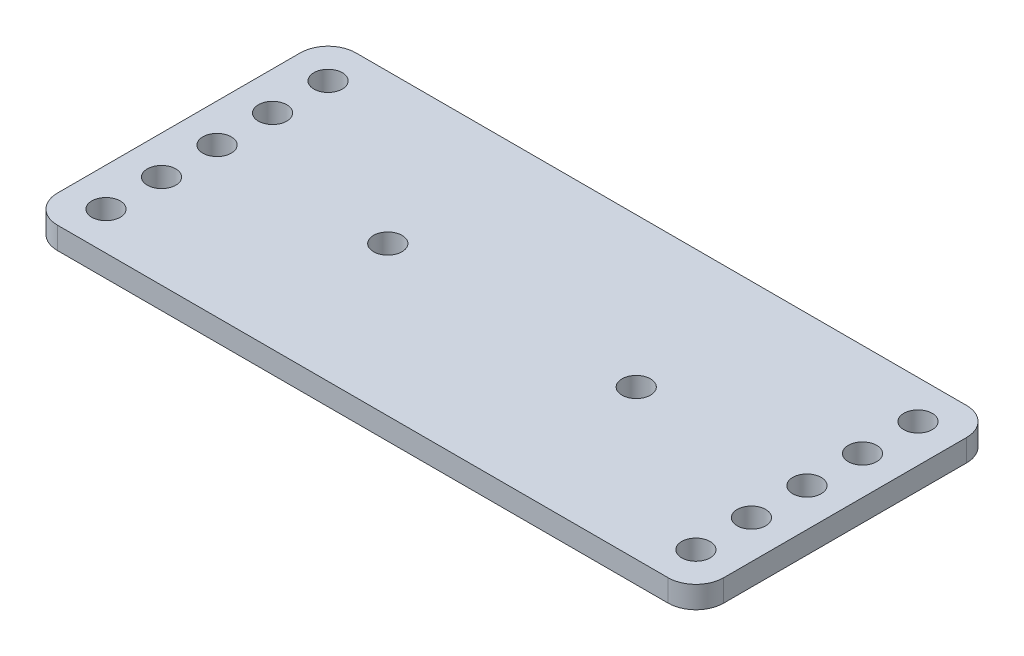
ISO-10303-21;
HEADER;
FILE_DESCRIPTION(('STEP AP214'),'2;1');
FILE_NAME('part.step','',(''),(''),'','','');
FILE_SCHEMA(('AUTOMOTIVE_DESIGN { 1 0 10303 214 1 1 1 1 }'));
ENDSEC;
DATA;
#1=APPLICATION_CONTEXT('core data for automotive mechanical design processes');
#2=APPLICATION_PROTOCOL_DEFINITION('international standard','automotive_design',2000,#1);
#3=PRODUCT_CONTEXT('',#1,'mechanical');
#4=PRODUCT('Part','Part','',(#3));
#5=PRODUCT_RELATED_PRODUCT_CATEGORY('part','',(#4));
#6=PRODUCT_DEFINITION_FORMATION('','',#4);
#7=PRODUCT_DEFINITION_CONTEXT('part definition',#1,'design');
#8=PRODUCT_DEFINITION('design','',#6,#7);
#9=PRODUCT_DEFINITION_SHAPE('','',#8);
#10=(LENGTH_UNIT() NAMED_UNIT(*) SI_UNIT(.MILLI.,.METRE.));
#11=(NAMED_UNIT(*) PLANE_ANGLE_UNIT() SI_UNIT($,.RADIAN.));
#12=(NAMED_UNIT(*) SI_UNIT($,.STERADIAN.) SOLID_ANGLE_UNIT());
#13=UNCERTAINTY_MEASURE_WITH_UNIT(LENGTH_MEASURE(1.E-05),#10,'distance_accuracy_value','');
#14=(GEOMETRIC_REPRESENTATION_CONTEXT(3) GLOBAL_UNCERTAINTY_ASSIGNED_CONTEXT((#13)) GLOBAL_UNIT_ASSIGNED_CONTEXT((#10,
#11,#12)) REPRESENTATION_CONTEXT('',''));
#15=CARTESIAN_POINT('',(0.,0.,0.));
#16=DIRECTION('',(0.,0.,1.));
#17=DIRECTION('',(1.,0.,0.));
#18=AXIS2_PLACEMENT_3D('',#15,#16,#17);
#19=CARTESIAN_POINT('',(0.,3.175,0.));
#20=DIRECTION('',(0.,1.,0.));
#21=DIRECTION('',(0.,0.,1.));
#22=AXIS2_PLACEMENT_3D('',#19,#20,#21);
#23=PLANE('',#22);
#24=CARTESIAN_POINT('',(42.4999999999997,3.175,16.));
#25=DIRECTION('',(0.,1.,0.));
#26=DIRECTION('',(0.,0.,-1.));
#27=AXIS2_PLACEMENT_3D('',#24,#25,#26);
#28=CIRCLE('',#27,2.05);
#29=CARTESIAN_POINT('',(42.4999999999997,3.175,13.95));
#30=VERTEX_POINT('',#29);
#31=EDGE_CURVE('E237',#30,#30,#28,.T.);
#32=ORIENTED_EDGE('',*,*,#31,.F.);
#33=EDGE_LOOP('',(#32));
#34=FACE_BOUND('',#33,.T.);
#35=CARTESIAN_POINT('',(42.4999999999998,3.175,0.));
#36=DIRECTION('',(0.,1.,0.));
#37=DIRECTION('',(0.,0.,-1.));
#38=AXIS2_PLACEMENT_3D('',#35,#36,#37);
#39=CIRCLE('',#38,2.05);
#40=CARTESIAN_POINT('',(42.4999999999998,3.175,-2.05));
#41=VERTEX_POINT('',#40);
#42=EDGE_CURVE('E225',#41,#41,#39,.T.);
#43=ORIENTED_EDGE('',*,*,#42,.F.);
#44=EDGE_LOOP('',(#43));
#45=FACE_BOUND('',#44,.T.);
#46=CARTESIAN_POINT('',(42.5,3.175,-16.));
#47=DIRECTION('',(0.,1.,0.));
#48=DIRECTION('',(0.,0.,-1.));
#49=AXIS2_PLACEMENT_3D('',#46,#47,#48);
#50=CIRCLE('',#49,2.05);
#51=CARTESIAN_POINT('',(42.5,3.175,-18.05));
#52=VERTEX_POINT('',#51);
#53=EDGE_CURVE('E213',#52,#52,#50,.T.);
#54=ORIENTED_EDGE('',*,*,#53,.F.);
#55=EDGE_LOOP('',(#54));
#56=FACE_BOUND('',#55,.T.);
#57=CARTESIAN_POINT('',(-42.4999999999997,3.175,8.));
#58=DIRECTION('',(0.,1.,0.));
#59=DIRECTION('',(0.,0.,1.));
#60=AXIS2_PLACEMENT_3D('',#57,#58,#59);
#61=CIRCLE('',#60,2.05);
#62=CARTESIAN_POINT('',(-42.4999999999997,3.175,10.05));
#63=VERTEX_POINT('',#62);
#64=EDGE_CURVE('E201',#63,#63,#61,.T.);
#65=ORIENTED_EDGE('',*,*,#64,.F.);
#66=EDGE_LOOP('',(#65));
#67=FACE_BOUND('',#66,.T.);
#68=CARTESIAN_POINT('',(-42.4999999999999,3.175,-8.));
#69=DIRECTION('',(0.,1.,0.));
#70=DIRECTION('',(0.,0.,1.));
#71=AXIS2_PLACEMENT_3D('',#68,#69,#70);
#72=CIRCLE('',#71,2.05);
#73=CARTESIAN_POINT('',(-42.4999999999999,3.175,-5.95));
#74=VERTEX_POINT('',#73);
#75=EDGE_CURVE('E189',#74,#74,#72,.T.);
#76=ORIENTED_EDGE('',*,*,#75,.F.);
#77=EDGE_LOOP('',(#76));
#78=FACE_BOUND('',#77,.T.);
#79=CARTESIAN_POINT('',(-17.9,3.175,0.));
#80=DIRECTION('',(0.,1.,0.));
#81=DIRECTION('',(0.,0.,1.));
#82=AXIS2_PLACEMENT_3D('',#79,#80,#81);
#83=CIRCLE('',#82,2.05);
#84=CARTESIAN_POINT('',(-17.9,3.175,2.05));
#85=VERTEX_POINT('',#84);
#86=EDGE_CURVE('E175',#85,#85,#83,.T.);
#87=ORIENTED_EDGE('',*,*,#86,.F.);
#88=EDGE_LOOP('',(#87));
#89=FACE_BOUND('',#88,.T.);
#90=DIRECTION('',(1.,0.,0.));
#91=VECTOR('',#90,1.);
#92=CARTESIAN_POINT('',(48.,3.175,21.5));
#93=LINE('',#92,#91);
#94=CARTESIAN_POINT('',(-44.,3.175,21.5));
#95=VERTEX_POINT('',#94);
#96=CARTESIAN_POINT('',(44.,3.175,21.5));
#97=VERTEX_POINT('',#96);
#98=EDGE_CURVE('E170',#95,#97,#93,.T.);
#99=ORIENTED_EDGE('',*,*,#98,.T.);
#100=CARTESIAN_POINT('',(44.,3.175,17.5));
#101=DIRECTION('',(0.,1.,0.));
#102=DIRECTION('',(0.,0.,1.));
#103=AXIS2_PLACEMENT_3D('',#100,#101,#102);
#104=CIRCLE('',#103,4.);
#105=CARTESIAN_POINT('',(48.,3.175,17.5));
#106=VERTEX_POINT('',#105);
#107=EDGE_CURVE('E151',#97,#106,#104,.T.);
#108=ORIENTED_EDGE('',*,*,#107,.T.);
#109=DIRECTION('',(0.,0.,-1.));
#110=VECTOR('',#109,1.);
#111=CARTESIAN_POINT('',(48.,3.175,21.5));
#112=LINE('',#111,#110);
#113=CARTESIAN_POINT('',(48.,3.175,-17.5));
#114=VERTEX_POINT('',#113);
#115=EDGE_CURVE('E121',#106,#114,#112,.T.);
#116=ORIENTED_EDGE('',*,*,#115,.T.);
#117=CARTESIAN_POINT('',(44.,3.175,-17.5));
#118=DIRECTION('',(0.,1.,0.));
#119=DIRECTION('',(0.,0.,1.));
#120=AXIS2_PLACEMENT_3D('',#117,#118,#119);
#121=CIRCLE('',#120,4.);
#122=CARTESIAN_POINT('',(44.,3.175,-21.5));
#123=VERTEX_POINT('',#122);
#124=EDGE_CURVE('E57',#114,#123,#121,.T.);
#125=ORIENTED_EDGE('',*,*,#124,.T.);
#126=DIRECTION('',(-1.,0.,0.));
#127=VECTOR('',#126,1.);
#128=CARTESIAN_POINT('',(48.,3.175,-21.5));
#129=LINE('',#128,#127);
#130=CARTESIAN_POINT('',(-44.,3.175,-21.5));
#131=VERTEX_POINT('',#130);
#132=EDGE_CURVE('E137',#123,#131,#129,.T.);
#133=ORIENTED_EDGE('',*,*,#132,.T.);
#134=CARTESIAN_POINT('',(-44.,3.175,-17.5));
#135=DIRECTION('',(0.,1.,0.));
#136=DIRECTION('',(0.,0.,1.));
#137=AXIS2_PLACEMENT_3D('',#134,#135,#136);
#138=CIRCLE('',#137,4.);
#139=CARTESIAN_POINT('',(-48.,3.175,-17.5));
#140=VERTEX_POINT('',#139);
#141=EDGE_CURVE('E148',#131,#140,#138,.T.);
#142=ORIENTED_EDGE('',*,*,#141,.T.);
#143=DIRECTION('',(0.,0.,1.));
#144=VECTOR('',#143,1.);
#145=CARTESIAN_POINT('',(-48.,3.175,21.5));
#146=LINE('',#145,#144);
#147=CARTESIAN_POINT('',(-48.,3.175,17.5));
#148=VERTEX_POINT('',#147);
#149=EDGE_CURVE('E131',#140,#148,#146,.T.);
#150=ORIENTED_EDGE('',*,*,#149,.T.);
#151=CARTESIAN_POINT('',(-44.,3.175,17.5));
#152=DIRECTION('',(0.,1.,0.));
#153=DIRECTION('',(0.,0.,1.));
#154=AXIS2_PLACEMENT_3D('',#151,#152,#153);
#155=CIRCLE('',#154,4.);
#156=EDGE_CURVE('E146',#148,#95,#155,.T.);
#157=ORIENTED_EDGE('',*,*,#156,.T.);
#158=EDGE_LOOP('',(#99,#108,#116,#125,#133,#142,#150,#157));
#159=FACE_BOUND('',#158,.T.);
#160=CARTESIAN_POINT('',(-42.5,3.175,-16.));
#161=DIRECTION('',(0.,1.,0.));
#162=DIRECTION('',(0.,0.,1.));
#163=AXIS2_PLACEMENT_3D('',#160,#161,#162);
#164=CIRCLE('',#163,2.05);
#165=CARTESIAN_POINT('',(-42.5,3.175,-13.95));
#166=VERTEX_POINT('',#165);
#167=EDGE_CURVE('E184',#166,#166,#164,.T.);
#168=ORIENTED_EDGE('',*,*,#167,.F.);
#169=EDGE_LOOP('',(#168));
#170=FACE_BOUND('',#169,.T.);
#171=CARTESIAN_POINT('',(-42.4999999999998,3.175,0.));
#172=DIRECTION('',(0.,1.,0.));
#173=DIRECTION('',(0.,0.,1.));
#174=AXIS2_PLACEMENT_3D('',#171,#172,#173);
#175=CIRCLE('',#174,2.05);
#176=CARTESIAN_POINT('',(-42.4999999999998,3.175,2.05));
#177=VERTEX_POINT('',#176);
#178=EDGE_CURVE('E195',#177,#177,#175,.T.);
#179=ORIENTED_EDGE('',*,*,#178,.F.);
#180=EDGE_LOOP('',(#179));
#181=FACE_BOUND('',#180,.T.);
#182=CARTESIAN_POINT('',(-42.4999999999997,3.175,16.));
#183=DIRECTION('',(0.,1.,0.));
#184=DIRECTION('',(0.,0.,1.));
#185=AXIS2_PLACEMENT_3D('',#182,#183,#184);
#186=CIRCLE('',#185,2.05);
#187=CARTESIAN_POINT('',(-42.4999999999997,3.175,18.05));
#188=VERTEX_POINT('',#187);
#189=EDGE_CURVE('E207',#188,#188,#186,.T.);
#190=ORIENTED_EDGE('',*,*,#189,.F.);
#191=EDGE_LOOP('',(#190));
#192=FACE_BOUND('',#191,.T.);
#193=CARTESIAN_POINT('',(42.4999999999999,3.175,-8.));
#194=DIRECTION('',(0.,1.,0.));
#195=DIRECTION('',(0.,0.,-1.));
#196=AXIS2_PLACEMENT_3D('',#193,#194,#195);
#197=CIRCLE('',#196,2.05);
#198=CARTESIAN_POINT('',(42.4999999999999,3.175,-10.05));
#199=VERTEX_POINT('',#198);
#200=EDGE_CURVE('E219',#199,#199,#197,.T.);
#201=ORIENTED_EDGE('',*,*,#200,.F.);
#202=EDGE_LOOP('',(#201));
#203=FACE_BOUND('',#202,.T.);
#204=CARTESIAN_POINT('',(42.4999999999997,3.175,8.));
#205=DIRECTION('',(0.,1.,0.));
#206=DIRECTION('',(0.,0.,-1.));
#207=AXIS2_PLACEMENT_3D('',#204,#205,#206);
#208=CIRCLE('',#207,2.05);
#209=CARTESIAN_POINT('',(42.4999999999997,3.175,5.95));
#210=VERTEX_POINT('',#209);
#211=EDGE_CURVE('E231',#210,#210,#208,.T.);
#212=ORIENTED_EDGE('',*,*,#211,.F.);
#213=EDGE_LOOP('',(#212));
#214=FACE_BOUND('',#213,.T.);
#215=CARTESIAN_POINT('',(17.9,3.175,0.));
#216=DIRECTION('',(0.,1.,0.));
#217=DIRECTION('',(0.,0.,1.));
#218=AXIS2_PLACEMENT_3D('',#215,#216,#217);
#219=CIRCLE('',#218,2.05);
#220=CARTESIAN_POINT('',(17.9,3.175,2.05));
#221=VERTEX_POINT('',#220);
#222=EDGE_CURVE('E243',#221,#221,#219,.T.);
#223=ORIENTED_EDGE('',*,*,#222,.F.);
#224=EDGE_LOOP('',(#223));
#225=FACE_BOUND('',#224,.T.);
#226=ADVANCED_FACE('F35',(#34,#45,#56,#67,#78,#89,#159,#170,#181,#192,#203,#214,#225),#23,.T.);
#227=CARTESIAN_POINT('',(0.,0.,0.));
#228=DIRECTION('',(0.,1.,0.));
#229=DIRECTION('',(0.,0.,1.));
#230=AXIS2_PLACEMENT_3D('',#227,#228,#229);
#231=PLANE('',#230);
#232=DIRECTION('',(0.,0.,-1.));
#233=VECTOR('',#232,1.);
#234=CARTESIAN_POINT('',(48.,0.,21.5));
#235=LINE('',#234,#233);
#236=CARTESIAN_POINT('',(48.,0.,17.5));
#237=VERTEX_POINT('',#236);
#238=CARTESIAN_POINT('',(48.,0.,-17.5));
#239=VERTEX_POINT('',#238);
#240=EDGE_CURVE('E119',#237,#239,#235,.T.);
#241=ORIENTED_EDGE('',*,*,#240,.F.);
#242=CARTESIAN_POINT('',(44.,0.,17.5));
#243=DIRECTION('',(0.,1.,0.));
#244=DIRECTION('',(0.,0.,1.));
#245=AXIS2_PLACEMENT_3D('',#242,#243,#244);
#246=CIRCLE('',#245,4.);
#247=CARTESIAN_POINT('',(44.,0.,21.5));
#248=VERTEX_POINT('',#247);
#249=EDGE_CURVE('E102',#237,#248,#246,.F.);
#250=ORIENTED_EDGE('',*,*,#249,.T.);
#251=DIRECTION('',(1.,0.,0.));
#252=VECTOR('',#251,1.);
#253=CARTESIAN_POINT('',(48.,0.,21.5));
#254=LINE('',#253,#252);
#255=CARTESIAN_POINT('',(-44.,0.,21.5));
#256=VERTEX_POINT('',#255);
#257=EDGE_CURVE('E129',#256,#248,#254,.T.);
#258=ORIENTED_EDGE('',*,*,#257,.F.);
#259=CARTESIAN_POINT('',(-44.,0.,17.5));
#260=DIRECTION('',(0.,1.,0.));
#261=DIRECTION('',(0.,0.,1.));
#262=AXIS2_PLACEMENT_3D('',#259,#260,#261);
#263=CIRCLE('',#262,4.);
#264=CARTESIAN_POINT('',(-48.,0.,17.5));
#265=VERTEX_POINT('',#264);
#266=EDGE_CURVE('E122',#256,#265,#263,.F.);
#267=ORIENTED_EDGE('',*,*,#266,.T.);
#268=DIRECTION('',(0.,0.,1.));
#269=VECTOR('',#268,1.);
#270=CARTESIAN_POINT('',(-48.,0.,21.5));
#271=LINE('',#270,#269);
#272=CARTESIAN_POINT('',(-48.,0.,-17.5));
#273=VERTEX_POINT('',#272);
#274=EDGE_CURVE('E133',#273,#265,#271,.T.);
#275=ORIENTED_EDGE('',*,*,#274,.F.);
#276=CARTESIAN_POINT('',(-44.,0.,-17.5));
#277=DIRECTION('',(0.,1.,0.));
#278=DIRECTION('',(0.,0.,1.));
#279=AXIS2_PLACEMENT_3D('',#276,#277,#278);
#280=CIRCLE('',#279,4.);
#281=CARTESIAN_POINT('',(-44.,0.,-21.5));
#282=VERTEX_POINT('',#281);
#283=EDGE_CURVE('E140',#273,#282,#280,.F.);
#284=ORIENTED_EDGE('',*,*,#283,.T.);
#285=DIRECTION('',(-1.,0.,0.));
#286=VECTOR('',#285,1.);
#287=CARTESIAN_POINT('',(48.,0.,-21.5));
#288=LINE('',#287,#286);
#289=CARTESIAN_POINT('',(44.,0.,-21.5));
#290=VERTEX_POINT('',#289);
#291=EDGE_CURVE('E128',#290,#282,#288,.T.);
#292=ORIENTED_EDGE('',*,*,#291,.F.);
#293=CARTESIAN_POINT('',(44.,0.,-17.5));
#294=DIRECTION('',(0.,1.,0.));
#295=DIRECTION('',(0.,0.,1.));
#296=AXIS2_PLACEMENT_3D('',#293,#294,#295);
#297=CIRCLE('',#296,4.);
#298=EDGE_CURVE('E113',#290,#239,#297,.F.);
#299=ORIENTED_EDGE('',*,*,#298,.T.);
#300=EDGE_LOOP('',(#241,#250,#258,#267,#275,#284,#292,#299));
#301=FACE_BOUND('',#300,.T.);
#302=CARTESIAN_POINT('',(-17.9,0.,0.));
#303=DIRECTION('',(0.,1.,0.));
#304=DIRECTION('',(0.,0.,1.));
#305=AXIS2_PLACEMENT_3D('',#302,#303,#304);
#306=CIRCLE('',#305,2.05);
#307=CARTESIAN_POINT('',(-17.9,0.,2.05));
#308=VERTEX_POINT('',#307);
#309=EDGE_CURVE('E177',#308,#308,#306,.T.);
#310=ORIENTED_EDGE('',*,*,#309,.T.);
#311=EDGE_LOOP('',(#310));
#312=FACE_BOUND('',#311,.T.);
#313=CARTESIAN_POINT('',(-42.5,0.,-16.));
#314=DIRECTION('',(0.,1.,0.));
#315=DIRECTION('',(0.,0.,1.));
#316=AXIS2_PLACEMENT_3D('',#313,#314,#315);
#317=CIRCLE('',#316,2.05);
#318=CARTESIAN_POINT('',(-42.5,0.,-13.95));
#319=VERTEX_POINT('',#318);
#320=EDGE_CURVE('E186',#319,#319,#317,.T.);
#321=ORIENTED_EDGE('',*,*,#320,.T.);
#322=EDGE_LOOP('',(#321));
#323=FACE_BOUND('',#322,.T.);
#324=CARTESIAN_POINT('',(-42.4999999999999,0.,-8.));
#325=DIRECTION('',(0.,1.,0.));
#326=DIRECTION('',(0.,0.,1.));
#327=AXIS2_PLACEMENT_3D('',#324,#325,#326);
#328=CIRCLE('',#327,2.05);
#329=CARTESIAN_POINT('',(-42.4999999999999,0.,-5.95));
#330=VERTEX_POINT('',#329);
#331=EDGE_CURVE('E192',#330,#330,#328,.T.);
#332=ORIENTED_EDGE('',*,*,#331,.T.);
#333=EDGE_LOOP('',(#332));
#334=FACE_BOUND('',#333,.T.);
#335=CARTESIAN_POINT('',(-42.4999999999998,0.,0.));
#336=DIRECTION('',(0.,1.,0.));
#337=DIRECTION('',(0.,0.,1.));
#338=AXIS2_PLACEMENT_3D('',#335,#336,#337);
#339=CIRCLE('',#338,2.05);
#340=CARTESIAN_POINT('',(-42.4999999999998,0.,2.05));
#341=VERTEX_POINT('',#340);
#342=EDGE_CURVE('E198',#341,#341,#339,.T.);
#343=ORIENTED_EDGE('',*,*,#342,.T.);
#344=EDGE_LOOP('',(#343));
#345=FACE_BOUND('',#344,.T.);
#346=CARTESIAN_POINT('',(-42.4999999999997,0.,8.));
#347=DIRECTION('',(0.,1.,0.));
#348=DIRECTION('',(0.,0.,1.));
#349=AXIS2_PLACEMENT_3D('',#346,#347,#348);
#350=CIRCLE('',#349,2.05);
#351=CARTESIAN_POINT('',(-42.4999999999997,0.,10.05));
#352=VERTEX_POINT('',#351);
#353=EDGE_CURVE('E204',#352,#352,#350,.T.);
#354=ORIENTED_EDGE('',*,*,#353,.T.);
#355=EDGE_LOOP('',(#354));
#356=FACE_BOUND('',#355,.T.);
#357=CARTESIAN_POINT('',(-42.4999999999997,0.,16.));
#358=DIRECTION('',(0.,1.,0.));
#359=DIRECTION('',(0.,0.,1.));
#360=AXIS2_PLACEMENT_3D('',#357,#358,#359);
#361=CIRCLE('',#360,2.05);
#362=CARTESIAN_POINT('',(-42.4999999999997,0.,18.05));
#363=VERTEX_POINT('',#362);
#364=EDGE_CURVE('E210',#363,#363,#361,.T.);
#365=ORIENTED_EDGE('',*,*,#364,.T.);
#366=EDGE_LOOP('',(#365));
#367=FACE_BOUND('',#366,.T.);
#368=CARTESIAN_POINT('',(42.5,0.,-16.));
#369=DIRECTION('',(0.,1.,0.));
#370=DIRECTION('',(0.,0.,-1.));
#371=AXIS2_PLACEMENT_3D('',#368,#369,#370);
#372=CIRCLE('',#371,2.05);
#373=CARTESIAN_POINT('',(42.5,0.,-18.05));
#374=VERTEX_POINT('',#373);
#375=EDGE_CURVE('E216',#374,#374,#372,.T.);
#376=ORIENTED_EDGE('',*,*,#375,.T.);
#377=EDGE_LOOP('',(#376));
#378=FACE_BOUND('',#377,.T.);
#379=CARTESIAN_POINT('',(42.4999999999999,0.,-8.));
#380=DIRECTION('',(0.,1.,0.));
#381=DIRECTION('',(0.,0.,-1.));
#382=AXIS2_PLACEMENT_3D('',#379,#380,#381);
#383=CIRCLE('',#382,2.05);
#384=CARTESIAN_POINT('',(42.4999999999999,0.,-10.05));
#385=VERTEX_POINT('',#384);
#386=EDGE_CURVE('E222',#385,#385,#383,.T.);
#387=ORIENTED_EDGE('',*,*,#386,.T.);
#388=EDGE_LOOP('',(#387));
#389=FACE_BOUND('',#388,.T.);
#390=CARTESIAN_POINT('',(42.4999999999998,0.,0.));
#391=DIRECTION('',(0.,1.,0.));
#392=DIRECTION('',(0.,0.,-1.));
#393=AXIS2_PLACEMENT_3D('',#390,#391,#392);
#394=CIRCLE('',#393,2.05);
#395=CARTESIAN_POINT('',(42.4999999999998,0.,-2.05));
#396=VERTEX_POINT('',#395);
#397=EDGE_CURVE('E228',#396,#396,#394,.T.);
#398=ORIENTED_EDGE('',*,*,#397,.T.);
#399=EDGE_LOOP('',(#398));
#400=FACE_BOUND('',#399,.T.);
#401=CARTESIAN_POINT('',(42.4999999999997,0.,8.));
#402=DIRECTION('',(0.,1.,0.));
#403=DIRECTION('',(0.,0.,-1.));
#404=AXIS2_PLACEMENT_3D('',#401,#402,#403);
#405=CIRCLE('',#404,2.05);
#406=CARTESIAN_POINT('',(42.4999999999997,0.,5.95));
#407=VERTEX_POINT('',#406);
#408=EDGE_CURVE('E234',#407,#407,#405,.T.);
#409=ORIENTED_EDGE('',*,*,#408,.T.);
#410=EDGE_LOOP('',(#409));
#411=FACE_BOUND('',#410,.T.);
#412=CARTESIAN_POINT('',(42.4999999999997,0.,16.));
#413=DIRECTION('',(0.,1.,0.));
#414=DIRECTION('',(0.,0.,-1.));
#415=AXIS2_PLACEMENT_3D('',#412,#413,#414);
#416=CIRCLE('',#415,2.05);
#417=CARTESIAN_POINT('',(42.4999999999997,0.,13.95));
#418=VERTEX_POINT('',#417);
#419=EDGE_CURVE('E240',#418,#418,#416,.T.);
#420=ORIENTED_EDGE('',*,*,#419,.T.);
#421=EDGE_LOOP('',(#420));
#422=FACE_BOUND('',#421,.T.);
#423=CARTESIAN_POINT('',(17.9,0.,0.));
#424=DIRECTION('',(0.,1.,0.));
#425=DIRECTION('',(0.,0.,1.));
#426=AXIS2_PLACEMENT_3D('',#423,#424,#425);
#427=CIRCLE('',#426,2.05);
#428=CARTESIAN_POINT('',(17.9,0.,2.05));
#429=VERTEX_POINT('',#428);
#430=EDGE_CURVE('E246',#429,#429,#427,.T.);
#431=ORIENTED_EDGE('',*,*,#430,.T.);
#432=EDGE_LOOP('',(#431));
#433=FACE_BOUND('',#432,.T.);
#434=ADVANCED_FACE('F125',(#301,#312,#323,#334,#345,#356,#367,#378,#389,#400,#411,#422,#433),
#231,.F.);
#435=CARTESIAN_POINT('',(-48.,3.175,21.5));
#436=DIRECTION('',(1.,0.,0.));
#437=DIRECTION('',(0.,0.,-1.));
#438=AXIS2_PLACEMENT_3D('',#435,#436,#437);
#439=PLANE('',#438);
#440=ORIENTED_EDGE('',*,*,#149,.F.);
#441=DIRECTION('',(0.,-1.,0.));
#442=VECTOR('',#441,1.);
#443=CARTESIAN_POINT('',(-48.,3.175,-17.5));
#444=LINE('',#443,#442);
#445=EDGE_CURVE('E11',#140,#273,#444,.T.);
#446=ORIENTED_EDGE('',*,*,#445,.T.);
#447=ORIENTED_EDGE('',*,*,#274,.T.);
#448=DIRECTION('',(0.,-1.,0.));
#449=VECTOR('',#448,1.);
#450=CARTESIAN_POINT('',(-48.,3.175,17.5));
#451=LINE('',#450,#449);
#452=EDGE_CURVE('E43',#265,#148,#451,.F.);
#453=ORIENTED_EDGE('',*,*,#452,.T.);
#454=EDGE_LOOP('',(#440,#446,#447,#453));
#455=FACE_BOUND('',#454,.T.);
#456=ADVANCED_FACE('F161',(#455),#439,.F.);
#457=CARTESIAN_POINT('',(48.,3.175,21.5));
#458=DIRECTION('',(0.,0.,-1.));
#459=DIRECTION('',(-1.,0.,0.));
#460=AXIS2_PLACEMENT_3D('',#457,#458,#459);
#461=PLANE('',#460);
#462=ORIENTED_EDGE('',*,*,#257,.T.);
#463=DIRECTION('',(0.,-1.,0.));
#464=VECTOR('',#463,1.);
#465=CARTESIAN_POINT('',(44.,3.175,21.5));
#466=LINE('',#465,#464);
#467=EDGE_CURVE('E107',#248,#97,#466,.F.);
#468=ORIENTED_EDGE('',*,*,#467,.T.);
#469=ORIENTED_EDGE('',*,*,#98,.F.);
#470=DIRECTION('',(0.,-1.,0.));
#471=VECTOR('',#470,1.);
#472=CARTESIAN_POINT('',(-44.,3.175,21.5));
#473=LINE('',#472,#471);
#474=EDGE_CURVE('E112',#95,#256,#473,.T.);
#475=ORIENTED_EDGE('',*,*,#474,.T.);
#476=EDGE_LOOP('',(#462,#468,#469,#475));
#477=FACE_BOUND('',#476,.T.);
#478=ADVANCED_FACE('F174',(#477),#461,.F.);
#479=CARTESIAN_POINT('',(48.,3.175,21.5));
#480=DIRECTION('',(-1.,0.,0.));
#481=DIRECTION('',(0.,0.,1.));
#482=AXIS2_PLACEMENT_3D('',#479,#480,#481);
#483=PLANE('',#482);
#484=ORIENTED_EDGE('',*,*,#115,.F.);
#485=DIRECTION('',(0.,-1.,0.));
#486=VECTOR('',#485,1.);
#487=CARTESIAN_POINT('',(48.,3.175,17.5));
#488=LINE('',#487,#486);
#489=EDGE_CURVE('E106',#106,#237,#488,.T.);
#490=ORIENTED_EDGE('',*,*,#489,.T.);
#491=ORIENTED_EDGE('',*,*,#240,.T.);
#492=DIRECTION('',(0.,-1.,0.));
#493=VECTOR('',#492,1.);
#494=CARTESIAN_POINT('',(48.,3.175,-17.5));
#495=LINE('',#494,#493);
#496=EDGE_CURVE('E123',#239,#114,#495,.F.);
#497=ORIENTED_EDGE('',*,*,#496,.T.);
#498=EDGE_LOOP('',(#484,#490,#491,#497));
#499=FACE_BOUND('',#498,.T.);
#500=ADVANCED_FACE('F118',(#499),#483,.F.);
#501=CARTESIAN_POINT('',(48.,3.175,-21.5));
#502=DIRECTION('',(0.,0.,1.));
#503=DIRECTION('',(1.,0.,0.));
#504=AXIS2_PLACEMENT_3D('',#501,#502,#503);
#505=PLANE('',#504);
#506=ORIENTED_EDGE('',*,*,#132,.F.);
#507=DIRECTION('',(0.,-1.,0.));
#508=VECTOR('',#507,1.);
#509=CARTESIAN_POINT('',(44.,3.175,-21.5));
#510=LINE('',#509,#508);
#511=EDGE_CURVE('E154',#123,#290,#510,.T.);
#512=ORIENTED_EDGE('',*,*,#511,.T.);
#513=ORIENTED_EDGE('',*,*,#291,.T.);
#514=DIRECTION('',(0.,-1.,0.));
#515=VECTOR('',#514,1.);
#516=CARTESIAN_POINT('',(-44.,3.175,-21.5));
#517=LINE('',#516,#515);
#518=EDGE_CURVE('E50',#282,#131,#517,.F.);
#519=ORIENTED_EDGE('',*,*,#518,.T.);
#520=EDGE_LOOP('',(#506,#512,#513,#519));
#521=FACE_BOUND('',#520,.T.);
#522=ADVANCED_FACE('F268',(#521),#505,.F.);
#523=CARTESIAN_POINT('',(-17.9,3.175,0.));
#524=DIRECTION('',(0.,-1.,0.));
#525=DIRECTION('',(0.,0.,-1.));
#526=AXIS2_PLACEMENT_3D('',#523,#524,#525);
#527=CYLINDRICAL_SURFACE('',#526,2.05);
#528=ORIENTED_EDGE('',*,*,#86,.T.);
#529=EDGE_LOOP('',(#528));
#530=FACE_BOUND('',#529,.T.);
#531=ORIENTED_EDGE('',*,*,#309,.F.);
#532=EDGE_LOOP('',(#531));
#533=FACE_BOUND('',#532,.T.);
#534=ADVANCED_FACE('F265',(#530,#533),#527,.F.);
#535=CARTESIAN_POINT('',(-42.5,3.175,-16.));
#536=DIRECTION('',(0.,-1.,0.));
#537=DIRECTION('',(0.,0.,-1.));
#538=AXIS2_PLACEMENT_3D('',#535,#536,#537);
#539=CYLINDRICAL_SURFACE('',#538,2.05);
#540=ORIENTED_EDGE('',*,*,#167,.T.);
#541=EDGE_LOOP('',(#540));
#542=FACE_BOUND('',#541,.T.);
#543=ORIENTED_EDGE('',*,*,#320,.F.);
#544=EDGE_LOOP('',(#543));
#545=FACE_BOUND('',#544,.T.);
#546=ADVANCED_FACE('F440',(#542,#545),#539,.F.);
#547=CARTESIAN_POINT('',(-42.4999999999999,3.175,-8.));
#548=DIRECTION('',(0.,-1.,0.));
#549=DIRECTION('',(0.,0.,-1.));
#550=AXIS2_PLACEMENT_3D('',#547,#548,#549);
#551=CYLINDRICAL_SURFACE('',#550,2.05);
#552=ORIENTED_EDGE('',*,*,#75,.T.);
#553=EDGE_LOOP('',(#552));
#554=FACE_BOUND('',#553,.T.);
#555=ORIENTED_EDGE('',*,*,#331,.F.);
#556=EDGE_LOOP('',(#555));
#557=FACE_BOUND('',#556,.T.);
#558=ADVANCED_FACE('F430',(#554,#557),#551,.F.);
#559=CARTESIAN_POINT('',(-42.4999999999998,3.175,0.));
#560=DIRECTION('',(0.,-1.,0.));
#561=DIRECTION('',(0.,0.,-1.));
#562=AXIS2_PLACEMENT_3D('',#559,#560,#561);
#563=CYLINDRICAL_SURFACE('',#562,2.05);
#564=ORIENTED_EDGE('',*,*,#178,.T.);
#565=EDGE_LOOP('',(#564));
#566=FACE_BOUND('',#565,.T.);
#567=ORIENTED_EDGE('',*,*,#342,.F.);
#568=EDGE_LOOP('',(#567));
#569=FACE_BOUND('',#568,.T.);
#570=ADVANCED_FACE('F420',(#566,#569),#563,.F.);
#571=CARTESIAN_POINT('',(-42.4999999999997,3.175,8.));
#572=DIRECTION('',(0.,-1.,0.));
#573=DIRECTION('',(0.,0.,-1.));
#574=AXIS2_PLACEMENT_3D('',#571,#572,#573);
#575=CYLINDRICAL_SURFACE('',#574,2.05);
#576=ORIENTED_EDGE('',*,*,#64,.T.);
#577=EDGE_LOOP('',(#576));
#578=FACE_BOUND('',#577,.T.);
#579=ORIENTED_EDGE('',*,*,#353,.F.);
#580=EDGE_LOOP('',(#579));
#581=FACE_BOUND('',#580,.T.);
#582=ADVANCED_FACE('F410',(#578,#581),#575,.F.);
#583=CARTESIAN_POINT('',(-42.4999999999997,3.175,16.));
#584=DIRECTION('',(0.,-1.,0.));
#585=DIRECTION('',(0.,0.,-1.));
#586=AXIS2_PLACEMENT_3D('',#583,#584,#585);
#587=CYLINDRICAL_SURFACE('',#586,2.05);
#588=ORIENTED_EDGE('',*,*,#189,.T.);
#589=EDGE_LOOP('',(#588));
#590=FACE_BOUND('',#589,.T.);
#591=ORIENTED_EDGE('',*,*,#364,.F.);
#592=EDGE_LOOP('',(#591));
#593=FACE_BOUND('',#592,.T.);
#594=ADVANCED_FACE('F400',(#590,#593),#587,.F.);
#595=CARTESIAN_POINT('',(42.5,3.175,-16.));
#596=DIRECTION('',(0.,-1.,0.));
#597=DIRECTION('',(0.,0.,-1.));
#598=AXIS2_PLACEMENT_3D('',#595,#596,#597);
#599=CYLINDRICAL_SURFACE('',#598,2.05);
#600=ORIENTED_EDGE('',*,*,#53,.T.);
#601=EDGE_LOOP('',(#600));
#602=FACE_BOUND('',#601,.T.);
#603=ORIENTED_EDGE('',*,*,#375,.F.);
#604=EDGE_LOOP('',(#603));
#605=FACE_BOUND('',#604,.T.);
#606=ADVANCED_FACE('F390',(#602,#605),#599,.F.);
#607=CARTESIAN_POINT('',(42.4999999999999,3.175,-8.));
#608=DIRECTION('',(0.,-1.,0.));
#609=DIRECTION('',(0.,0.,-1.));
#610=AXIS2_PLACEMENT_3D('',#607,#608,#609);
#611=CYLINDRICAL_SURFACE('',#610,2.05);
#612=ORIENTED_EDGE('',*,*,#200,.T.);
#613=EDGE_LOOP('',(#612));
#614=FACE_BOUND('',#613,.T.);
#615=ORIENTED_EDGE('',*,*,#386,.F.);
#616=EDGE_LOOP('',(#615));
#617=FACE_BOUND('',#616,.T.);
#618=ADVANCED_FACE('F380',(#614,#617),#611,.F.);
#619=CARTESIAN_POINT('',(42.4999999999998,3.175,0.));
#620=DIRECTION('',(0.,-1.,0.));
#621=DIRECTION('',(0.,0.,-1.));
#622=AXIS2_PLACEMENT_3D('',#619,#620,#621);
#623=CYLINDRICAL_SURFACE('',#622,2.05);
#624=ORIENTED_EDGE('',*,*,#42,.T.);
#625=EDGE_LOOP('',(#624));
#626=FACE_BOUND('',#625,.T.);
#627=ORIENTED_EDGE('',*,*,#397,.F.);
#628=EDGE_LOOP('',(#627));
#629=FACE_BOUND('',#628,.T.);
#630=ADVANCED_FACE('F370',(#626,#629),#623,.F.);
#631=CARTESIAN_POINT('',(42.4999999999997,3.175,8.));
#632=DIRECTION('',(0.,-1.,0.));
#633=DIRECTION('',(0.,0.,-1.));
#634=AXIS2_PLACEMENT_3D('',#631,#632,#633);
#635=CYLINDRICAL_SURFACE('',#634,2.05);
#636=ORIENTED_EDGE('',*,*,#211,.T.);
#637=EDGE_LOOP('',(#636));
#638=FACE_BOUND('',#637,.T.);
#639=ORIENTED_EDGE('',*,*,#408,.F.);
#640=EDGE_LOOP('',(#639));
#641=FACE_BOUND('',#640,.T.);
#642=ADVANCED_FACE('F360',(#638,#641),#635,.F.);
#643=CARTESIAN_POINT('',(42.4999999999997,3.175,16.));
#644=DIRECTION('',(0.,-1.,0.));
#645=DIRECTION('',(0.,0.,-1.));
#646=AXIS2_PLACEMENT_3D('',#643,#644,#645);
#647=CYLINDRICAL_SURFACE('',#646,2.05);
#648=ORIENTED_EDGE('',*,*,#31,.T.);
#649=EDGE_LOOP('',(#648));
#650=FACE_BOUND('',#649,.T.);
#651=ORIENTED_EDGE('',*,*,#419,.F.);
#652=EDGE_LOOP('',(#651));
#653=FACE_BOUND('',#652,.T.);
#654=ADVANCED_FACE('F351',(#650,#653),#647,.F.);
#655=CARTESIAN_POINT('',(17.9,3.175,0.));
#656=DIRECTION('',(0.,-1.,0.));
#657=DIRECTION('',(0.,0.,-1.));
#658=AXIS2_PLACEMENT_3D('',#655,#656,#657);
#659=CYLINDRICAL_SURFACE('',#658,2.05);
#660=ORIENTED_EDGE('',*,*,#222,.T.);
#661=EDGE_LOOP('',(#660));
#662=FACE_BOUND('',#661,.T.);
#663=ORIENTED_EDGE('',*,*,#430,.F.);
#664=EDGE_LOOP('',(#663));
#665=FACE_BOUND('',#664,.T.);
#666=ADVANCED_FACE('F252',(#662,#665),#659,.F.);
#667=CARTESIAN_POINT('',(44.,3.175,17.5));
#668=DIRECTION('',(0.,-1.,0.));
#669=DIRECTION('',(0.,0.,-1.));
#670=AXIS2_PLACEMENT_3D('',#667,#668,#669);
#671=CYLINDRICAL_SURFACE('',#670,4.);
#672=ORIENTED_EDGE('',*,*,#107,.F.);
#673=ORIENTED_EDGE('',*,*,#467,.F.);
#674=ORIENTED_EDGE('',*,*,#249,.F.);
#675=ORIENTED_EDGE('',*,*,#489,.F.);
#676=EDGE_LOOP('',(#672,#673,#674,#675));
#677=FACE_BOUND('',#676,.T.);
#678=ADVANCED_FACE('F105',(#677),#671,.T.);
#679=CARTESIAN_POINT('',(44.,3.175,-17.5));
#680=DIRECTION('',(0.,-1.,0.));
#681=DIRECTION('',(0.,0.,-1.));
#682=AXIS2_PLACEMENT_3D('',#679,#680,#681);
#683=CYLINDRICAL_SURFACE('',#682,4.);
#684=ORIENTED_EDGE('',*,*,#124,.F.);
#685=ORIENTED_EDGE('',*,*,#496,.F.);
#686=ORIENTED_EDGE('',*,*,#298,.F.);
#687=ORIENTED_EDGE('',*,*,#511,.F.);
#688=EDGE_LOOP('',(#684,#685,#686,#687));
#689=FACE_BOUND('',#688,.T.);
#690=ADVANCED_FACE('F279',(#689),#683,.T.);
#691=CARTESIAN_POINT('',(-44.,3.175,-17.5));
#692=DIRECTION('',(0.,-1.,0.));
#693=DIRECTION('',(0.,0.,-1.));
#694=AXIS2_PLACEMENT_3D('',#691,#692,#693);
#695=CYLINDRICAL_SURFACE('',#694,4.);
#696=ORIENTED_EDGE('',*,*,#141,.F.);
#697=ORIENTED_EDGE('',*,*,#518,.F.);
#698=ORIENTED_EDGE('',*,*,#283,.F.);
#699=ORIENTED_EDGE('',*,*,#445,.F.);
#700=EDGE_LOOP('',(#696,#697,#698,#699));
#701=FACE_BOUND('',#700,.T.);
#702=ADVANCED_FACE('F281',(#701),#695,.T.);
#703=CARTESIAN_POINT('',(-44.,3.175,17.5));
#704=DIRECTION('',(0.,-1.,0.));
#705=DIRECTION('',(0.,0.,-1.));
#706=AXIS2_PLACEMENT_3D('',#703,#704,#705);
#707=CYLINDRICAL_SURFACE('',#706,4.);
#708=ORIENTED_EDGE('',*,*,#156,.F.);
#709=ORIENTED_EDGE('',*,*,#452,.F.);
#710=ORIENTED_EDGE('',*,*,#266,.F.);
#711=ORIENTED_EDGE('',*,*,#474,.F.);
#712=EDGE_LOOP('',(#708,#709,#710,#711));
#713=FACE_BOUND('',#712,.T.);
#714=ADVANCED_FACE('F37',(#713),#707,.T.);
#715=CLOSED_SHELL('',(#226,#434,#456,#478,#500,#522,#534,#546,#558,#570,#582,#594,#606,#618,
#630,#642,#654,#666,#678,#690,#702,#714));
#716=MANIFOLD_SOLID_BREP('B2',#715);
#717=ADVANCED_BREP_SHAPE_REPRESENTATION('',(#18,#716),#14);
#718=SHAPE_DEFINITION_REPRESENTATION(#9,#717);
ENDSEC;
END-ISO-10303-21;
